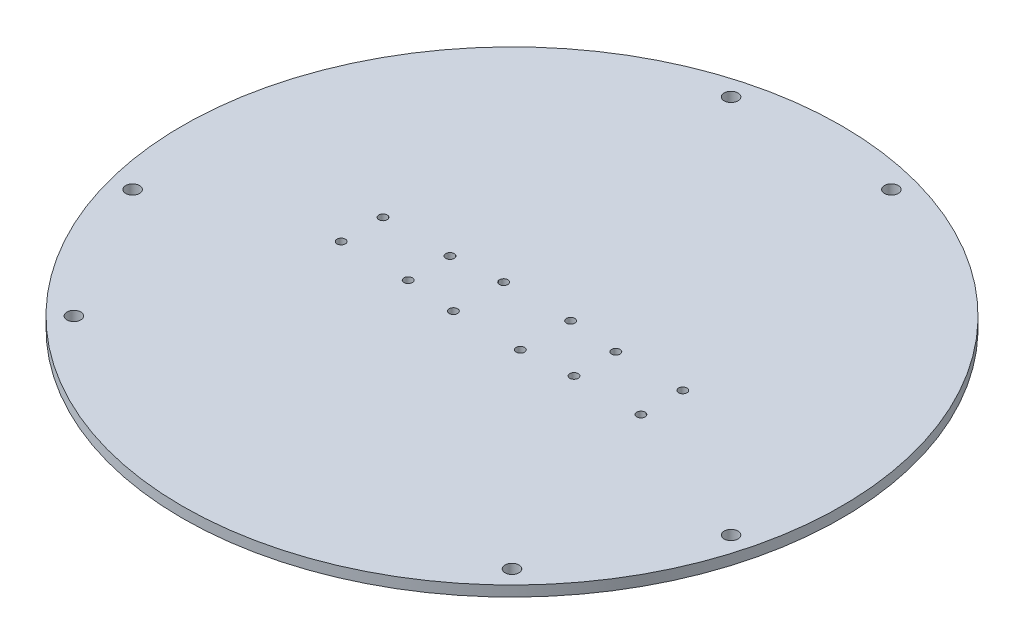
ISO-10303-21;
HEADER;
FILE_DESCRIPTION(('STEP AP214'),'2;1');
FILE_NAME('part.step','',(''),(''),'','','');
FILE_SCHEMA(('AUTOMOTIVE_DESIGN { 1 0 10303 214 1 1 1 1 }'));
ENDSEC;
DATA;
#1=APPLICATION_CONTEXT('core data for automotive mechanical design processes');
#2=APPLICATION_PROTOCOL_DEFINITION('international standard','automotive_design',2000,#1);
#3=PRODUCT_CONTEXT('',#1,'mechanical');
#4=PRODUCT('Part','Part','',(#3));
#5=PRODUCT_RELATED_PRODUCT_CATEGORY('part','',(#4));
#6=PRODUCT_DEFINITION_FORMATION('','',#4);
#7=PRODUCT_DEFINITION_CONTEXT('part definition',#1,'design');
#8=PRODUCT_DEFINITION('design','',#6,#7);
#9=PRODUCT_DEFINITION_SHAPE('','',#8);
#10=(LENGTH_UNIT() NAMED_UNIT(*) SI_UNIT(.MILLI.,.METRE.));
#11=(NAMED_UNIT(*) PLANE_ANGLE_UNIT() SI_UNIT($,.RADIAN.));
#12=(NAMED_UNIT(*) SI_UNIT($,.STERADIAN.) SOLID_ANGLE_UNIT());
#13=UNCERTAINTY_MEASURE_WITH_UNIT(LENGTH_MEASURE(1.E-05),#10,'distance_accuracy_value','');
#14=(GEOMETRIC_REPRESENTATION_CONTEXT(3) GLOBAL_UNCERTAINTY_ASSIGNED_CONTEXT((#13)) GLOBAL_UNIT_ASSIGNED_CONTEXT((#10,
#11,#12)) REPRESENTATION_CONTEXT('',''));
#15=CARTESIAN_POINT('',(0.,0.,0.));
#16=DIRECTION('',(0.,0.,1.));
#17=DIRECTION('',(1.,0.,0.));
#18=AXIS2_PLACEMENT_3D('',#15,#16,#17);
#19=CARTESIAN_POINT('',(0.,3.175,0.));
#20=DIRECTION('',(0.,1.,0.));
#21=DIRECTION('',(0.,0.,1.));
#22=AXIS2_PLACEMENT_3D('',#19,#20,#21);
#23=PLANE('',#22);
#24=CARTESIAN_POINT('',(-25.16,3.175,6.35));
#25=DIRECTION('',(0.,1.,0.));
#26=DIRECTION('',(0.,0.,-1.));
#27=AXIS2_PLACEMENT_3D('',#24,#25,#26);
#28=CIRCLE('',#27,1.27);
#29=CARTESIAN_POINT('',(-25.16,3.175,5.08));
#30=VERTEX_POINT('',#29);
#31=EDGE_CURVE('E137',#30,#30,#28,.T.);
#32=ORIENTED_EDGE('',*,*,#31,.F.);
#33=EDGE_LOOP('',(#32));
#34=FACE_BOUND('',#33,.T.);
#35=CARTESIAN_POINT('',(-45.48,3.175,-6.35));
#36=DIRECTION('',(0.,1.,0.));
#37=DIRECTION('',(0.,0.,-1.));
#38=AXIS2_PLACEMENT_3D('',#35,#36,#37);
#39=CIRCLE('',#38,1.27);
#40=CARTESIAN_POINT('',(-45.48,3.175,-7.62));
#41=VERTEX_POINT('',#40);
#42=EDGE_CURVE('E125',#41,#41,#39,.T.);
#43=ORIENTED_EDGE('',*,*,#42,.F.);
#44=EDGE_LOOP('',(#43));
#45=FACE_BOUND('',#44,.T.);
#46=CARTESIAN_POINT('',(45.48,3.175,6.35));
#47=DIRECTION('',(0.,1.,0.));
#48=DIRECTION('',(0.,0.,1.));
#49=AXIS2_PLACEMENT_3D('',#46,#47,#48);
#50=CIRCLE('',#49,1.27);
#51=CARTESIAN_POINT('',(45.48,3.175,7.62));
#52=VERTEX_POINT('',#51);
#53=EDGE_CURVE('E113',#52,#52,#50,.T.);
#54=ORIENTED_EDGE('',*,*,#53,.F.);
#55=EDGE_LOOP('',(#54));
#56=FACE_BOUND('',#55,.T.);
#57=CARTESIAN_POINT('',(25.16,3.175,-6.35));
#58=DIRECTION('',(0.,1.,0.));
#59=DIRECTION('',(0.,0.,1.));
#60=AXIS2_PLACEMENT_3D('',#57,#58,#59);
#61=CIRCLE('',#60,1.27);
#62=CARTESIAN_POINT('',(25.16,3.175,-5.08));
#63=VERTEX_POINT('',#62);
#64=EDGE_CURVE('E101',#63,#63,#61,.T.);
#65=ORIENTED_EDGE('',*,*,#64,.F.);
#66=EDGE_LOOP('',(#65));
#67=FACE_BOUND('',#66,.T.);
#68=CARTESIAN_POINT('',(10.16,3.175,7.62));
#69=DIRECTION('',(0.,1.,0.));
#70=DIRECTION('',(0.,0.,1.));
#71=AXIS2_PLACEMENT_3D('',#68,#69,#70);
#72=CIRCLE('',#71,1.27);
#73=CARTESIAN_POINT('',(10.16,3.175,8.89));
#74=VERTEX_POINT('',#73);
#75=EDGE_CURVE('E89',#74,#74,#72,.T.);
#76=ORIENTED_EDGE('',*,*,#75,.F.);
#77=EDGE_LOOP('',(#76));
#78=FACE_BOUND('',#77,.T.);
#79=CARTESIAN_POINT('',(-10.16,3.175,-7.62));
#80=DIRECTION('',(0.,1.,0.));
#81=DIRECTION('',(0.,0.,1.));
#82=AXIS2_PLACEMENT_3D('',#79,#80,#81);
#83=CIRCLE('',#82,1.27);
#84=CARTESIAN_POINT('',(-10.16,3.175,-6.35));
#85=VERTEX_POINT('',#84);
#86=EDGE_CURVE('E77',#85,#85,#83,.T.);
#87=ORIENTED_EDGE('',*,*,#86,.F.);
#88=EDGE_LOOP('',(#87));
#89=FACE_BOUND('',#88,.T.);
#90=CARTESIAN_POINT('',(-90.7970276711725,3.175,24.3289902396367));
#91=DIRECTION('',(0.,1.,0.));
#92=DIRECTION('',(0.,0.,1.));
#93=AXIS2_PLACEMENT_3D('',#90,#91,#92);
#94=CIRCLE('',#93,2.10000000000001);
#95=CARTESIAN_POINT('',(-90.7970276711725,3.175,26.4289902396367));
#96=VERTEX_POINT('',#95);
#97=EDGE_CURVE('E65',#96,#96,#94,.T.);
#98=ORIENTED_EDGE('',*,*,#97,.F.);
#99=EDGE_LOOP('',(#98));
#100=FACE_BOUND('',#99,.T.);
#101=CARTESIAN_POINT('',(66.4680374315356,3.175,66.4680374315354));
#102=DIRECTION('',(0.,1.,0.));
#103=DIRECTION('',(0.,0.,1.));
#104=AXIS2_PLACEMENT_3D('',#101,#102,#103);
#105=CIRCLE('',#104,2.09999999999999);
#106=CARTESIAN_POINT('',(66.4680374315356,3.175,68.5680374315354));
#107=VERTEX_POINT('',#106);
#108=EDGE_CURVE('E53',#107,#107,#105,.T.);
#109=ORIENTED_EDGE('',*,*,#108,.F.);
#110=EDGE_LOOP('',(#109));
#111=FACE_BOUND('',#110,.T.);
#112=CARTESIAN_POINT('',(24.3289902396363,3.175,-90.7970276711726));
#113=DIRECTION('',(0.,1.,0.));
#114=DIRECTION('',(0.,0.,1.));
#115=AXIS2_PLACEMENT_3D('',#112,#113,#114);
#116=CIRCLE('',#115,2.1);
#117=CARTESIAN_POINT('',(24.3289902396363,3.175,-88.6970276711726));
#118=VERTEX_POINT('',#117);
#119=EDGE_CURVE('E42',#118,#118,#116,.T.);
#120=ORIENTED_EDGE('',*,*,#119,.F.);
#121=EDGE_LOOP('',(#120));
#122=FACE_BOUND('',#121,.T.);
#123=CARTESIAN_POINT('',(0.,3.175,0.));
#124=DIRECTION('',(0.,1.,0.));
#125=DIRECTION('',(0.,0.,1.));
#126=AXIS2_PLACEMENT_3D('',#123,#124,#125);
#127=CIRCLE('',#126,100.);
#128=CARTESIAN_POINT('',(0.,3.175,100.));
#129=VERTEX_POINT('',#128);
#130=EDGE_CURVE('E10',#129,#129,#127,.T.);
#131=ORIENTED_EDGE('',*,*,#130,.T.);
#132=EDGE_LOOP('',(#131));
#133=FACE_BOUND('',#132,.T.);
#134=CARTESIAN_POINT('',(-24.3289902396363,3.175,-90.7970276711726));
#135=DIRECTION('',(0.,1.,0.));
#136=DIRECTION('',(0.,0.,-1.));
#137=AXIS2_PLACEMENT_3D('',#134,#135,#136);
#138=CIRCLE('',#137,2.1);
#139=CARTESIAN_POINT('',(-24.3289902396363,3.175,-92.8970276711726));
#140=VERTEX_POINT('',#139);
#141=EDGE_CURVE('E47',#140,#140,#138,.T.);
#142=ORIENTED_EDGE('',*,*,#141,.F.);
#143=EDGE_LOOP('',(#142));
#144=FACE_BOUND('',#143,.T.);
#145=CARTESIAN_POINT('',(90.7970276711722,3.175,24.328990239638));
#146=DIRECTION('',(0.,1.,0.));
#147=DIRECTION('',(0.,0.,-1.));
#148=AXIS2_PLACEMENT_3D('',#145,#146,#147);
#149=CIRCLE('',#148,2.09999999999999);
#150=CARTESIAN_POINT('',(90.7970276711722,3.175,22.228990239638));
#151=VERTEX_POINT('',#150);
#152=EDGE_CURVE('E59',#151,#151,#149,.T.);
#153=ORIENTED_EDGE('',*,*,#152,.F.);
#154=EDGE_LOOP('',(#153));
#155=FACE_BOUND('',#154,.T.);
#156=CARTESIAN_POINT('',(-66.4680374315365,3.175,66.4680374315344));
#157=DIRECTION('',(0.,1.,0.));
#158=DIRECTION('',(0.,0.,-1.));
#159=AXIS2_PLACEMENT_3D('',#156,#157,#158);
#160=CIRCLE('',#159,2.10000000000002);
#161=CARTESIAN_POINT('',(-66.4680374315365,3.175,64.3680374315344));
#162=VERTEX_POINT('',#161);
#163=EDGE_CURVE('E71',#162,#162,#160,.T.);
#164=ORIENTED_EDGE('',*,*,#163,.F.);
#165=EDGE_LOOP('',(#164));
#166=FACE_BOUND('',#165,.T.);
#167=CARTESIAN_POINT('',(-10.16,3.175,7.62));
#168=DIRECTION('',(0.,1.,0.));
#169=DIRECTION('',(0.,0.,1.));
#170=AXIS2_PLACEMENT_3D('',#167,#168,#169);
#171=CIRCLE('',#170,1.27);
#172=CARTESIAN_POINT('',(-10.16,3.175,8.89));
#173=VERTEX_POINT('',#172);
#174=EDGE_CURVE('E83',#173,#173,#171,.T.);
#175=ORIENTED_EDGE('',*,*,#174,.F.);
#176=EDGE_LOOP('',(#175));
#177=FACE_BOUND('',#176,.T.);
#178=CARTESIAN_POINT('',(10.16,3.175,-7.62));
#179=DIRECTION('',(0.,1.,0.));
#180=DIRECTION('',(0.,0.,1.));
#181=AXIS2_PLACEMENT_3D('',#178,#179,#180);
#182=CIRCLE('',#181,1.27);
#183=CARTESIAN_POINT('',(10.16,3.175,-6.35));
#184=VERTEX_POINT('',#183);
#185=EDGE_CURVE('E95',#184,#184,#182,.T.);
#186=ORIENTED_EDGE('',*,*,#185,.F.);
#187=EDGE_LOOP('',(#186));
#188=FACE_BOUND('',#187,.T.);
#189=CARTESIAN_POINT('',(25.16,3.175,6.35));
#190=DIRECTION('',(0.,1.,0.));
#191=DIRECTION('',(0.,0.,1.));
#192=AXIS2_PLACEMENT_3D('',#189,#190,#191);
#193=CIRCLE('',#192,1.27);
#194=CARTESIAN_POINT('',(25.16,3.175,7.62));
#195=VERTEX_POINT('',#194);
#196=EDGE_CURVE('E107',#195,#195,#193,.T.);
#197=ORIENTED_EDGE('',*,*,#196,.F.);
#198=EDGE_LOOP('',(#197));
#199=FACE_BOUND('',#198,.T.);
#200=CARTESIAN_POINT('',(45.48,3.175,-6.35));
#201=DIRECTION('',(0.,1.,0.));
#202=DIRECTION('',(0.,0.,1.));
#203=AXIS2_PLACEMENT_3D('',#200,#201,#202);
#204=CIRCLE('',#203,1.27);
#205=CARTESIAN_POINT('',(45.48,3.175,-5.08));
#206=VERTEX_POINT('',#205);
#207=EDGE_CURVE('E119',#206,#206,#204,.T.);
#208=ORIENTED_EDGE('',*,*,#207,.F.);
#209=EDGE_LOOP('',(#208));
#210=FACE_BOUND('',#209,.T.);
#211=CARTESIAN_POINT('',(-45.48,3.175,6.35));
#212=DIRECTION('',(0.,1.,0.));
#213=DIRECTION('',(0.,0.,-1.));
#214=AXIS2_PLACEMENT_3D('',#211,#212,#213);
#215=CIRCLE('',#214,1.27);
#216=CARTESIAN_POINT('',(-45.48,3.175,5.08));
#217=VERTEX_POINT('',#216);
#218=EDGE_CURVE('E131',#217,#217,#215,.T.);
#219=ORIENTED_EDGE('',*,*,#218,.F.);
#220=EDGE_LOOP('',(#219));
#221=FACE_BOUND('',#220,.T.);
#222=CARTESIAN_POINT('',(-25.16,3.175,-6.35));
#223=DIRECTION('',(0.,1.,0.));
#224=DIRECTION('',(0.,0.,-1.));
#225=AXIS2_PLACEMENT_3D('',#222,#223,#224);
#226=CIRCLE('',#225,1.27);
#227=CARTESIAN_POINT('',(-25.16,3.175,-7.62));
#228=VERTEX_POINT('',#227);
#229=EDGE_CURVE('E143',#228,#228,#226,.T.);
#230=ORIENTED_EDGE('',*,*,#229,.F.);
#231=EDGE_LOOP('',(#230));
#232=FACE_BOUND('',#231,.T.);
#233=ADVANCED_FACE('F31',(#34,#45,#56,#67,#78,#89,#100,#111,#122,#133,#144,#155,#166,#177,#188,
#199,#210,#221,#232),#23,.T.);
#234=CARTESIAN_POINT('',(0.,0.,0.));
#235=DIRECTION('',(0.,1.,0.));
#236=DIRECTION('',(0.,0.,1.));
#237=AXIS2_PLACEMENT_3D('',#234,#235,#236);
#238=PLANE('',#237);
#239=CARTESIAN_POINT('',(0.,0.,0.));
#240=DIRECTION('',(0.,1.,0.));
#241=DIRECTION('',(0.,0.,1.));
#242=AXIS2_PLACEMENT_3D('',#239,#240,#241);
#243=CIRCLE('',#242,100.);
#244=CARTESIAN_POINT('',(0.,0.,100.));
#245=VERTEX_POINT('',#244);
#246=EDGE_CURVE('E35',#245,#245,#243,.T.);
#247=ORIENTED_EDGE('',*,*,#246,.F.);
#248=EDGE_LOOP('',(#247));
#249=FACE_BOUND('',#248,.T.);
#250=CARTESIAN_POINT('',(24.3289902396363,0.,-90.7970276711726));
#251=DIRECTION('',(0.,1.,0.));
#252=DIRECTION('',(0.,0.,1.));
#253=AXIS2_PLACEMENT_3D('',#250,#251,#252);
#254=CIRCLE('',#253,2.1);
#255=CARTESIAN_POINT('',(24.3289902396363,0.,-88.6970276711726));
#256=VERTEX_POINT('',#255);
#257=EDGE_CURVE('E44',#256,#256,#254,.T.);
#258=ORIENTED_EDGE('',*,*,#257,.T.);
#259=EDGE_LOOP('',(#258));
#260=FACE_BOUND('',#259,.T.);
#261=CARTESIAN_POINT('',(-24.3289902396363,0.,-90.7970276711726));
#262=DIRECTION('',(0.,1.,0.));
#263=DIRECTION('',(0.,0.,-1.));
#264=AXIS2_PLACEMENT_3D('',#261,#262,#263);
#265=CIRCLE('',#264,2.1);
#266=CARTESIAN_POINT('',(-24.3289902396363,0.,-92.8970276711726));
#267=VERTEX_POINT('',#266);
#268=EDGE_CURVE('E50',#267,#267,#265,.T.);
#269=ORIENTED_EDGE('',*,*,#268,.T.);
#270=EDGE_LOOP('',(#269));
#271=FACE_BOUND('',#270,.T.);
#272=CARTESIAN_POINT('',(66.4680374315356,0.,66.4680374315354));
#273=DIRECTION('',(0.,1.,0.));
#274=DIRECTION('',(0.,0.,1.));
#275=AXIS2_PLACEMENT_3D('',#272,#273,#274);
#276=CIRCLE('',#275,2.09999999999999);
#277=CARTESIAN_POINT('',(66.4680374315356,0.,68.5680374315354));
#278=VERTEX_POINT('',#277);
#279=EDGE_CURVE('E56',#278,#278,#276,.T.);
#280=ORIENTED_EDGE('',*,*,#279,.T.);
#281=EDGE_LOOP('',(#280));
#282=FACE_BOUND('',#281,.T.);
#283=CARTESIAN_POINT('',(90.7970276711722,0.,24.328990239638));
#284=DIRECTION('',(0.,1.,0.));
#285=DIRECTION('',(0.,0.,-1.));
#286=AXIS2_PLACEMENT_3D('',#283,#284,#285);
#287=CIRCLE('',#286,2.09999999999999);
#288=CARTESIAN_POINT('',(90.7970276711722,0.,22.228990239638));
#289=VERTEX_POINT('',#288);
#290=EDGE_CURVE('E62',#289,#289,#287,.T.);
#291=ORIENTED_EDGE('',*,*,#290,.T.);
#292=EDGE_LOOP('',(#291));
#293=FACE_BOUND('',#292,.T.);
#294=CARTESIAN_POINT('',(-90.7970276711725,0.,24.3289902396367));
#295=DIRECTION('',(0.,1.,0.));
#296=DIRECTION('',(0.,0.,1.));
#297=AXIS2_PLACEMENT_3D('',#294,#295,#296);
#298=CIRCLE('',#297,2.10000000000001);
#299=CARTESIAN_POINT('',(-90.7970276711725,0.,26.4289902396367));
#300=VERTEX_POINT('',#299);
#301=EDGE_CURVE('E68',#300,#300,#298,.T.);
#302=ORIENTED_EDGE('',*,*,#301,.T.);
#303=EDGE_LOOP('',(#302));
#304=FACE_BOUND('',#303,.T.);
#305=CARTESIAN_POINT('',(-66.4680374315365,0.,66.4680374315344));
#306=DIRECTION('',(0.,1.,0.));
#307=DIRECTION('',(0.,0.,-1.));
#308=AXIS2_PLACEMENT_3D('',#305,#306,#307);
#309=CIRCLE('',#308,2.10000000000002);
#310=CARTESIAN_POINT('',(-66.4680374315365,0.,64.3680374315344));
#311=VERTEX_POINT('',#310);
#312=EDGE_CURVE('E74',#311,#311,#309,.T.);
#313=ORIENTED_EDGE('',*,*,#312,.T.);
#314=EDGE_LOOP('',(#313));
#315=FACE_BOUND('',#314,.T.);
#316=CARTESIAN_POINT('',(-10.16,0.,-7.62));
#317=DIRECTION('',(0.,1.,0.));
#318=DIRECTION('',(0.,0.,1.));
#319=AXIS2_PLACEMENT_3D('',#316,#317,#318);
#320=CIRCLE('',#319,1.27);
#321=CARTESIAN_POINT('',(-10.16,0.,-6.35));
#322=VERTEX_POINT('',#321);
#323=EDGE_CURVE('E80',#322,#322,#320,.T.);
#324=ORIENTED_EDGE('',*,*,#323,.T.);
#325=EDGE_LOOP('',(#324));
#326=FACE_BOUND('',#325,.T.);
#327=CARTESIAN_POINT('',(-10.16,0.,7.62));
#328=DIRECTION('',(0.,1.,0.));
#329=DIRECTION('',(0.,0.,1.));
#330=AXIS2_PLACEMENT_3D('',#327,#328,#329);
#331=CIRCLE('',#330,1.27);
#332=CARTESIAN_POINT('',(-10.16,0.,8.89));
#333=VERTEX_POINT('',#332);
#334=EDGE_CURVE('E86',#333,#333,#331,.T.);
#335=ORIENTED_EDGE('',*,*,#334,.T.);
#336=EDGE_LOOP('',(#335));
#337=FACE_BOUND('',#336,.T.);
#338=CARTESIAN_POINT('',(10.16,0.,7.62));
#339=DIRECTION('',(0.,1.,0.));
#340=DIRECTION('',(0.,0.,1.));
#341=AXIS2_PLACEMENT_3D('',#338,#339,#340);
#342=CIRCLE('',#341,1.27);
#343=CARTESIAN_POINT('',(10.16,0.,8.89));
#344=VERTEX_POINT('',#343);
#345=EDGE_CURVE('E92',#344,#344,#342,.T.);
#346=ORIENTED_EDGE('',*,*,#345,.T.);
#347=EDGE_LOOP('',(#346));
#348=FACE_BOUND('',#347,.T.);
#349=CARTESIAN_POINT('',(10.16,0.,-7.62));
#350=DIRECTION('',(0.,1.,0.));
#351=DIRECTION('',(0.,0.,1.));
#352=AXIS2_PLACEMENT_3D('',#349,#350,#351);
#353=CIRCLE('',#352,1.27);
#354=CARTESIAN_POINT('',(10.16,0.,-6.35));
#355=VERTEX_POINT('',#354);
#356=EDGE_CURVE('E98',#355,#355,#353,.T.);
#357=ORIENTED_EDGE('',*,*,#356,.T.);
#358=EDGE_LOOP('',(#357));
#359=FACE_BOUND('',#358,.T.);
#360=CARTESIAN_POINT('',(25.16,0.,-6.35));
#361=DIRECTION('',(0.,1.,0.));
#362=DIRECTION('',(0.,0.,1.));
#363=AXIS2_PLACEMENT_3D('',#360,#361,#362);
#364=CIRCLE('',#363,1.27);
#365=CARTESIAN_POINT('',(25.16,0.,-5.08));
#366=VERTEX_POINT('',#365);
#367=EDGE_CURVE('E104',#366,#366,#364,.T.);
#368=ORIENTED_EDGE('',*,*,#367,.T.);
#369=EDGE_LOOP('',(#368));
#370=FACE_BOUND('',#369,.T.);
#371=CARTESIAN_POINT('',(25.16,0.,6.35));
#372=DIRECTION('',(0.,1.,0.));
#373=DIRECTION('',(0.,0.,1.));
#374=AXIS2_PLACEMENT_3D('',#371,#372,#373);
#375=CIRCLE('',#374,1.27);
#376=CARTESIAN_POINT('',(25.16,0.,7.62));
#377=VERTEX_POINT('',#376);
#378=EDGE_CURVE('E110',#377,#377,#375,.T.);
#379=ORIENTED_EDGE('',*,*,#378,.T.);
#380=EDGE_LOOP('',(#379));
#381=FACE_BOUND('',#380,.T.);
#382=CARTESIAN_POINT('',(45.48,0.,6.35));
#383=DIRECTION('',(0.,1.,0.));
#384=DIRECTION('',(0.,0.,1.));
#385=AXIS2_PLACEMENT_3D('',#382,#383,#384);
#386=CIRCLE('',#385,1.27);
#387=CARTESIAN_POINT('',(45.48,0.,7.62));
#388=VERTEX_POINT('',#387);
#389=EDGE_CURVE('E116',#388,#388,#386,.T.);
#390=ORIENTED_EDGE('',*,*,#389,.T.);
#391=EDGE_LOOP('',(#390));
#392=FACE_BOUND('',#391,.T.);
#393=CARTESIAN_POINT('',(45.48,0.,-6.35));
#394=DIRECTION('',(0.,1.,0.));
#395=DIRECTION('',(0.,0.,1.));
#396=AXIS2_PLACEMENT_3D('',#393,#394,#395);
#397=CIRCLE('',#396,1.27);
#398=CARTESIAN_POINT('',(45.48,0.,-5.08));
#399=VERTEX_POINT('',#398);
#400=EDGE_CURVE('E122',#399,#399,#397,.T.);
#401=ORIENTED_EDGE('',*,*,#400,.T.);
#402=EDGE_LOOP('',(#401));
#403=FACE_BOUND('',#402,.T.);
#404=CARTESIAN_POINT('',(-45.48,0.,-6.35));
#405=DIRECTION('',(0.,1.,0.));
#406=DIRECTION('',(0.,0.,-1.));
#407=AXIS2_PLACEMENT_3D('',#404,#405,#406);
#408=CIRCLE('',#407,1.27);
#409=CARTESIAN_POINT('',(-45.48,0.,-7.62));
#410=VERTEX_POINT('',#409);
#411=EDGE_CURVE('E128',#410,#410,#408,.T.);
#412=ORIENTED_EDGE('',*,*,#411,.T.);
#413=EDGE_LOOP('',(#412));
#414=FACE_BOUND('',#413,.T.);
#415=CARTESIAN_POINT('',(-45.48,0.,6.35));
#416=DIRECTION('',(0.,1.,0.));
#417=DIRECTION('',(0.,0.,-1.));
#418=AXIS2_PLACEMENT_3D('',#415,#416,#417);
#419=CIRCLE('',#418,1.27);
#420=CARTESIAN_POINT('',(-45.48,0.,5.08));
#421=VERTEX_POINT('',#420);
#422=EDGE_CURVE('E134',#421,#421,#419,.T.);
#423=ORIENTED_EDGE('',*,*,#422,.T.);
#424=EDGE_LOOP('',(#423));
#425=FACE_BOUND('',#424,.T.);
#426=CARTESIAN_POINT('',(-25.16,0.,6.35));
#427=DIRECTION('',(0.,1.,0.));
#428=DIRECTION('',(0.,0.,-1.));
#429=AXIS2_PLACEMENT_3D('',#426,#427,#428);
#430=CIRCLE('',#429,1.27);
#431=CARTESIAN_POINT('',(-25.16,0.,5.08));
#432=VERTEX_POINT('',#431);
#433=EDGE_CURVE('E140',#432,#432,#430,.T.);
#434=ORIENTED_EDGE('',*,*,#433,.T.);
#435=EDGE_LOOP('',(#434));
#436=FACE_BOUND('',#435,.T.);
#437=CARTESIAN_POINT('',(-25.16,0.,-6.35));
#438=DIRECTION('',(0.,1.,0.));
#439=DIRECTION('',(0.,0.,-1.));
#440=AXIS2_PLACEMENT_3D('',#437,#438,#439);
#441=CIRCLE('',#440,1.27);
#442=CARTESIAN_POINT('',(-25.16,0.,-7.62));
#443=VERTEX_POINT('',#442);
#444=EDGE_CURVE('E146',#443,#443,#441,.T.);
#445=ORIENTED_EDGE('',*,*,#444,.T.);
#446=EDGE_LOOP('',(#445));
#447=FACE_BOUND('',#446,.T.);
#448=ADVANCED_FACE('F156',(#249,#260,#271,#282,#293,#304,#315,#326,#337,#348,#359,#370,#381,
#392,#403,#414,#425,#436,#447),#238,.F.);
#449=CARTESIAN_POINT('',(0.,3.175,0.));
#450=DIRECTION('',(0.,-1.,0.));
#451=DIRECTION('',(0.,0.,-1.));
#452=AXIS2_PLACEMENT_3D('',#449,#450,#451);
#453=CYLINDRICAL_SURFACE('',#452,100.);
#454=ORIENTED_EDGE('',*,*,#130,.F.);
#455=EDGE_LOOP('',(#454));
#456=FACE_BOUND('',#455,.T.);
#457=ORIENTED_EDGE('',*,*,#246,.T.);
#458=EDGE_LOOP('',(#457));
#459=FACE_BOUND('',#458,.T.);
#460=ADVANCED_FACE('F33',(#456,#459),#453,.T.);
#461=CARTESIAN_POINT('',(24.3289902396363,3.175,-90.7970276711726));
#462=DIRECTION('',(0.,-1.,0.));
#463=DIRECTION('',(0.,0.,-1.));
#464=AXIS2_PLACEMENT_3D('',#461,#462,#463);
#465=CYLINDRICAL_SURFACE('',#464,2.1);
#466=ORIENTED_EDGE('',*,*,#119,.T.);
#467=EDGE_LOOP('',(#466));
#468=FACE_BOUND('',#467,.T.);
#469=ORIENTED_EDGE('',*,*,#257,.F.);
#470=EDGE_LOOP('',(#469));
#471=FACE_BOUND('',#470,.T.);
#472=ADVANCED_FACE('F166',(#468,#471),#465,.F.);
#473=CARTESIAN_POINT('',(-24.3289902396363,3.175,-90.7970276711726));
#474=DIRECTION('',(0.,-1.,0.));
#475=DIRECTION('',(0.,0.,-1.));
#476=AXIS2_PLACEMENT_3D('',#473,#474,#475);
#477=CYLINDRICAL_SURFACE('',#476,2.1);
#478=ORIENTED_EDGE('',*,*,#141,.T.);
#479=EDGE_LOOP('',(#478));
#480=FACE_BOUND('',#479,.T.);
#481=ORIENTED_EDGE('',*,*,#268,.F.);
#482=EDGE_LOOP('',(#481));
#483=FACE_BOUND('',#482,.T.);
#484=ADVANCED_FACE('F169',(#480,#483),#477,.F.);
#485=CARTESIAN_POINT('',(66.4680374315356,3.175,66.4680374315354));
#486=DIRECTION('',(0.,-1.,0.));
#487=DIRECTION('',(0.,0.,-1.));
#488=AXIS2_PLACEMENT_3D('',#485,#486,#487);
#489=CYLINDRICAL_SURFACE('',#488,2.09999999999999);
#490=ORIENTED_EDGE('',*,*,#108,.T.);
#491=EDGE_LOOP('',(#490));
#492=FACE_BOUND('',#491,.T.);
#493=ORIENTED_EDGE('',*,*,#279,.F.);
#494=EDGE_LOOP('',(#493));
#495=FACE_BOUND('',#494,.T.);
#496=ADVANCED_FACE('F173',(#492,#495),#489,.F.);
#497=CARTESIAN_POINT('',(90.7970276711722,3.175,24.328990239638));
#498=DIRECTION('',(0.,-1.,0.));
#499=DIRECTION('',(0.,0.,-1.));
#500=AXIS2_PLACEMENT_3D('',#497,#498,#499);
#501=CYLINDRICAL_SURFACE('',#500,2.09999999999999);
#502=ORIENTED_EDGE('',*,*,#152,.T.);
#503=EDGE_LOOP('',(#502));
#504=FACE_BOUND('',#503,.T.);
#505=ORIENTED_EDGE('',*,*,#290,.F.);
#506=EDGE_LOOP('',(#505));
#507=FACE_BOUND('',#506,.T.);
#508=ADVANCED_FACE('F177',(#504,#507),#501,.F.);
#509=CARTESIAN_POINT('',(-90.7970276711725,3.175,24.3289902396367));
#510=DIRECTION('',(0.,-1.,0.));
#511=DIRECTION('',(0.,0.,-1.));
#512=AXIS2_PLACEMENT_3D('',#509,#510,#511);
#513=CYLINDRICAL_SURFACE('',#512,2.10000000000001);
#514=ORIENTED_EDGE('',*,*,#97,.T.);
#515=EDGE_LOOP('',(#514));
#516=FACE_BOUND('',#515,.T.);
#517=ORIENTED_EDGE('',*,*,#301,.F.);
#518=EDGE_LOOP('',(#517));
#519=FACE_BOUND('',#518,.T.);
#520=ADVANCED_FACE('F181',(#516,#519),#513,.F.);
#521=CARTESIAN_POINT('',(-66.4680374315365,3.175,66.4680374315344));
#522=DIRECTION('',(0.,-1.,0.));
#523=DIRECTION('',(0.,0.,-1.));
#524=AXIS2_PLACEMENT_3D('',#521,#522,#523);
#525=CYLINDRICAL_SURFACE('',#524,2.10000000000002);
#526=ORIENTED_EDGE('',*,*,#163,.T.);
#527=EDGE_LOOP('',(#526));
#528=FACE_BOUND('',#527,.T.);
#529=ORIENTED_EDGE('',*,*,#312,.F.);
#530=EDGE_LOOP('',(#529));
#531=FACE_BOUND('',#530,.T.);
#532=ADVANCED_FACE('F185',(#528,#531),#525,.F.);
#533=CARTESIAN_POINT('',(-10.16,3.175,-7.62));
#534=DIRECTION('',(0.,-1.,0.));
#535=DIRECTION('',(0.,0.,-1.));
#536=AXIS2_PLACEMENT_3D('',#533,#534,#535);
#537=CYLINDRICAL_SURFACE('',#536,1.27);
#538=ORIENTED_EDGE('',*,*,#86,.T.);
#539=EDGE_LOOP('',(#538));
#540=FACE_BOUND('',#539,.T.);
#541=ORIENTED_EDGE('',*,*,#323,.F.);
#542=EDGE_LOOP('',(#541));
#543=FACE_BOUND('',#542,.T.);
#544=ADVANCED_FACE('F189',(#540,#543),#537,.F.);
#545=CARTESIAN_POINT('',(-10.16,3.175,7.62));
#546=DIRECTION('',(0.,-1.,0.));
#547=DIRECTION('',(0.,0.,-1.));
#548=AXIS2_PLACEMENT_3D('',#545,#546,#547);
#549=CYLINDRICAL_SURFACE('',#548,1.27);
#550=ORIENTED_EDGE('',*,*,#174,.T.);
#551=EDGE_LOOP('',(#550));
#552=FACE_BOUND('',#551,.T.);
#553=ORIENTED_EDGE('',*,*,#334,.F.);
#554=EDGE_LOOP('',(#553));
#555=FACE_BOUND('',#554,.T.);
#556=ADVANCED_FACE('F193',(#552,#555),#549,.F.);
#557=CARTESIAN_POINT('',(10.16,3.175,7.62));
#558=DIRECTION('',(0.,-1.,0.));
#559=DIRECTION('',(0.,0.,-1.));
#560=AXIS2_PLACEMENT_3D('',#557,#558,#559);
#561=CYLINDRICAL_SURFACE('',#560,1.27);
#562=ORIENTED_EDGE('',*,*,#75,.T.);
#563=EDGE_LOOP('',(#562));
#564=FACE_BOUND('',#563,.T.);
#565=ORIENTED_EDGE('',*,*,#345,.F.);
#566=EDGE_LOOP('',(#565));
#567=FACE_BOUND('',#566,.T.);
#568=ADVANCED_FACE('F197',(#564,#567),#561,.F.);
#569=CARTESIAN_POINT('',(10.16,3.175,-7.62));
#570=DIRECTION('',(0.,-1.,0.));
#571=DIRECTION('',(0.,0.,-1.));
#572=AXIS2_PLACEMENT_3D('',#569,#570,#571);
#573=CYLINDRICAL_SURFACE('',#572,1.27);
#574=ORIENTED_EDGE('',*,*,#185,.T.);
#575=EDGE_LOOP('',(#574));
#576=FACE_BOUND('',#575,.T.);
#577=ORIENTED_EDGE('',*,*,#356,.F.);
#578=EDGE_LOOP('',(#577));
#579=FACE_BOUND('',#578,.T.);
#580=ADVANCED_FACE('F201',(#576,#579),#573,.F.);
#581=CARTESIAN_POINT('',(25.16,3.175,-6.35));
#582=DIRECTION('',(0.,-1.,0.));
#583=DIRECTION('',(0.,0.,-1.));
#584=AXIS2_PLACEMENT_3D('',#581,#582,#583);
#585=CYLINDRICAL_SURFACE('',#584,1.27);
#586=ORIENTED_EDGE('',*,*,#64,.T.);
#587=EDGE_LOOP('',(#586));
#588=FACE_BOUND('',#587,.T.);
#589=ORIENTED_EDGE('',*,*,#367,.F.);
#590=EDGE_LOOP('',(#589));
#591=FACE_BOUND('',#590,.T.);
#592=ADVANCED_FACE('F205',(#588,#591),#585,.F.);
#593=CARTESIAN_POINT('',(25.16,3.175,6.35));
#594=DIRECTION('',(0.,-1.,0.));
#595=DIRECTION('',(0.,0.,-1.));
#596=AXIS2_PLACEMENT_3D('',#593,#594,#595);
#597=CYLINDRICAL_SURFACE('',#596,1.27);
#598=ORIENTED_EDGE('',*,*,#196,.T.);
#599=EDGE_LOOP('',(#598));
#600=FACE_BOUND('',#599,.T.);
#601=ORIENTED_EDGE('',*,*,#378,.F.);
#602=EDGE_LOOP('',(#601));
#603=FACE_BOUND('',#602,.T.);
#604=ADVANCED_FACE('F209',(#600,#603),#597,.F.);
#605=CARTESIAN_POINT('',(45.48,3.175,6.35));
#606=DIRECTION('',(0.,-1.,0.));
#607=DIRECTION('',(0.,0.,-1.));
#608=AXIS2_PLACEMENT_3D('',#605,#606,#607);
#609=CYLINDRICAL_SURFACE('',#608,1.27);
#610=ORIENTED_EDGE('',*,*,#53,.T.);
#611=EDGE_LOOP('',(#610));
#612=FACE_BOUND('',#611,.T.);
#613=ORIENTED_EDGE('',*,*,#389,.F.);
#614=EDGE_LOOP('',(#613));
#615=FACE_BOUND('',#614,.T.);
#616=ADVANCED_FACE('F213',(#612,#615),#609,.F.);
#617=CARTESIAN_POINT('',(45.48,3.175,-6.35));
#618=DIRECTION('',(0.,-1.,0.));
#619=DIRECTION('',(0.,0.,-1.));
#620=AXIS2_PLACEMENT_3D('',#617,#618,#619);
#621=CYLINDRICAL_SURFACE('',#620,1.27);
#622=ORIENTED_EDGE('',*,*,#207,.T.);
#623=EDGE_LOOP('',(#622));
#624=FACE_BOUND('',#623,.T.);
#625=ORIENTED_EDGE('',*,*,#400,.F.);
#626=EDGE_LOOP('',(#625));
#627=FACE_BOUND('',#626,.T.);
#628=ADVANCED_FACE('F217',(#624,#627),#621,.F.);
#629=CARTESIAN_POINT('',(-45.48,3.175,-6.35));
#630=DIRECTION('',(0.,-1.,0.));
#631=DIRECTION('',(0.,0.,-1.));
#632=AXIS2_PLACEMENT_3D('',#629,#630,#631);
#633=CYLINDRICAL_SURFACE('',#632,1.27);
#634=ORIENTED_EDGE('',*,*,#42,.T.);
#635=EDGE_LOOP('',(#634));
#636=FACE_BOUND('',#635,.T.);
#637=ORIENTED_EDGE('',*,*,#411,.F.);
#638=EDGE_LOOP('',(#637));
#639=FACE_BOUND('',#638,.T.);
#640=ADVANCED_FACE('F221',(#636,#639),#633,.F.);
#641=CARTESIAN_POINT('',(-45.48,3.175,6.35));
#642=DIRECTION('',(0.,-1.,0.));
#643=DIRECTION('',(0.,0.,-1.));
#644=AXIS2_PLACEMENT_3D('',#641,#642,#643);
#645=CYLINDRICAL_SURFACE('',#644,1.27);
#646=ORIENTED_EDGE('',*,*,#218,.T.);
#647=EDGE_LOOP('',(#646));
#648=FACE_BOUND('',#647,.T.);
#649=ORIENTED_EDGE('',*,*,#422,.F.);
#650=EDGE_LOOP('',(#649));
#651=FACE_BOUND('',#650,.T.);
#652=ADVANCED_FACE('F225',(#648,#651),#645,.F.);
#653=CARTESIAN_POINT('',(-25.16,3.175,6.35));
#654=DIRECTION('',(0.,-1.,0.));
#655=DIRECTION('',(0.,0.,-1.));
#656=AXIS2_PLACEMENT_3D('',#653,#654,#655);
#657=CYLINDRICAL_SURFACE('',#656,1.27);
#658=ORIENTED_EDGE('',*,*,#31,.T.);
#659=EDGE_LOOP('',(#658));
#660=FACE_BOUND('',#659,.T.);
#661=ORIENTED_EDGE('',*,*,#433,.F.);
#662=EDGE_LOOP('',(#661));
#663=FACE_BOUND('',#662,.T.);
#664=ADVANCED_FACE('F229',(#660,#663),#657,.F.);
#665=CARTESIAN_POINT('',(-25.16,3.175,-6.35));
#666=DIRECTION('',(0.,-1.,0.));
#667=DIRECTION('',(0.,0.,-1.));
#668=AXIS2_PLACEMENT_3D('',#665,#666,#667);
#669=CYLINDRICAL_SURFACE('',#668,1.27);
#670=ORIENTED_EDGE('',*,*,#229,.T.);
#671=EDGE_LOOP('',(#670));
#672=FACE_BOUND('',#671,.T.);
#673=ORIENTED_EDGE('',*,*,#444,.F.);
#674=EDGE_LOOP('',(#673));
#675=FACE_BOUND('',#674,.T.);
#676=ADVANCED_FACE('F152',(#672,#675),#669,.F.);
#677=CLOSED_SHELL('',(#233,#448,#460,#472,#484,#496,#508,#520,#532,#544,#556,#568,#580,#592,
#604,#616,#628,#640,#652,#664,#676));
#678=MANIFOLD_SOLID_BREP('B2',#677);
#679=ADVANCED_BREP_SHAPE_REPRESENTATION('',(#18,#678),#14);
#680=SHAPE_DEFINITION_REPRESENTATION(#9,#679);
ENDSEC;
END-ISO-10303-21;
